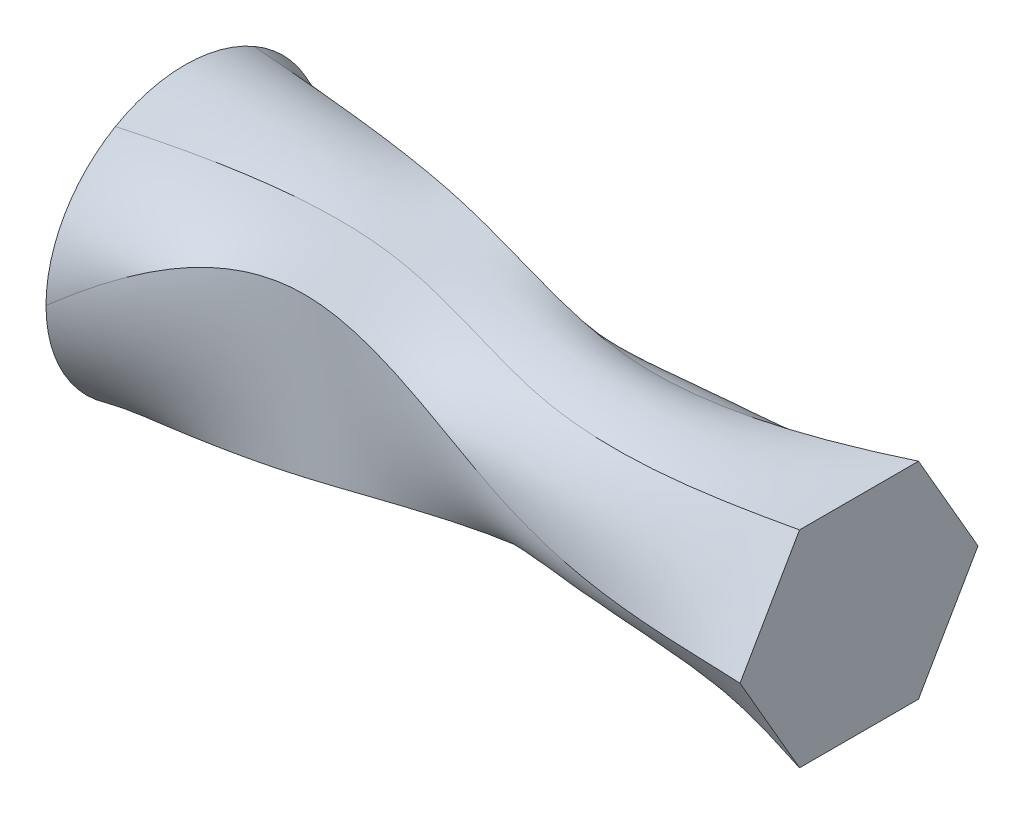
ISO-10303-21;
HEADER;
FILE_DESCRIPTION(('STEP AP214'),'2;1');
FILE_NAME('part.step','',(''),(''),'','','');
FILE_SCHEMA(('AUTOMOTIVE_DESIGN { 1 0 10303 214 1 1 1 1 }'));
ENDSEC;
DATA;
#1=APPLICATION_CONTEXT('core data for automotive mechanical design processes');
#2=APPLICATION_PROTOCOL_DEFINITION('international standard','automotive_design',2000,#1);
#3=PRODUCT_CONTEXT('',#1,'mechanical');
#4=PRODUCT('Part','Part','',(#3));
#5=PRODUCT_RELATED_PRODUCT_CATEGORY('part','',(#4));
#6=PRODUCT_DEFINITION_FORMATION('','',#4);
#7=PRODUCT_DEFINITION_CONTEXT('part definition',#1,'design');
#8=PRODUCT_DEFINITION('design','',#6,#7);
#9=PRODUCT_DEFINITION_SHAPE('','',#8);
#10=(LENGTH_UNIT() NAMED_UNIT(*) SI_UNIT(.MILLI.,.METRE.));
#11=(NAMED_UNIT(*) PLANE_ANGLE_UNIT() SI_UNIT($,.RADIAN.));
#12=(NAMED_UNIT(*) SI_UNIT($,.STERADIAN.) SOLID_ANGLE_UNIT());
#13=UNCERTAINTY_MEASURE_WITH_UNIT(LENGTH_MEASURE(1.E-05),#10,'distance_accuracy_value','');
#14=(GEOMETRIC_REPRESENTATION_CONTEXT(3) GLOBAL_UNCERTAINTY_ASSIGNED_CONTEXT((#13)) GLOBAL_UNIT_ASSIGNED_CONTEXT((#10,
#11,#12)) REPRESENTATION_CONTEXT('',''));
#15=CARTESIAN_POINT('',(0.,0.,0.));
#16=DIRECTION('',(0.,0.,1.));
#17=DIRECTION('',(1.,0.,0.));
#18=AXIS2_PLACEMENT_3D('',#15,#16,#17);
#19=CARTESIAN_POINT('',(431.8,0.,0.));
#20=DIRECTION('',(1.,0.,0.));
#21=DIRECTION('',(0.,0.,-1.));
#22=AXIS2_PLACEMENT_3D('',#19,#20,#21);
#23=PLANE('',#22);
#24=DIRECTION('',(0.,0.866025403784439,-0.5));
#25=VECTOR('',#24,1.);
#26=CARTESIAN_POINT('',(431.8,-65.9911357683743,-38.1));
#27=LINE('',#26,#25);
#28=CARTESIAN_POINT('',(431.8,-65.9911357683743,-38.1));
#29=VERTEX_POINT('',#28);
#30=CARTESIAN_POINT('',(431.8,0.,-76.2));
#31=VERTEX_POINT('',#30);
#32=EDGE_CURVE('E161',#29,#31,#27,.T.);
#33=ORIENTED_EDGE('',*,*,#32,.T.);
#34=DIRECTION('',(0.,0.866025403784439,0.5));
#35=VECTOR('',#34,1.);
#36=CARTESIAN_POINT('',(431.8,0.,-76.2));
#37=LINE('',#36,#35);
#38=CARTESIAN_POINT('',(431.8,65.9911357683743,-38.1));
#39=VERTEX_POINT('',#38);
#40=EDGE_CURVE('E242',#31,#39,#37,.T.);
#41=ORIENTED_EDGE('',*,*,#40,.T.);
#42=DIRECTION('',(0.,0.,1.));
#43=VECTOR('',#42,1.);
#44=CARTESIAN_POINT('',(431.8,65.9911357683743,-38.1));
#45=LINE('',#44,#43);
#46=CARTESIAN_POINT('',(431.8,65.9911357683743,38.1));
#47=VERTEX_POINT('',#46);
#48=EDGE_CURVE('E362',#39,#47,#45,.T.);
#49=ORIENTED_EDGE('',*,*,#48,.T.);
#50=DIRECTION('',(0.,-0.866025403784439,0.5));
#51=VECTOR('',#50,1.);
#52=CARTESIAN_POINT('',(431.8,65.9911357683743,38.1));
#53=LINE('',#52,#51);
#54=CARTESIAN_POINT('',(431.8,0.,76.2));
#55=VERTEX_POINT('',#54);
#56=EDGE_CURVE('E331',#47,#55,#53,.T.);
#57=ORIENTED_EDGE('',*,*,#56,.T.);
#58=DIRECTION('',(0.,-0.866025403784439,-0.5));
#59=VECTOR('',#58,1.);
#60=CARTESIAN_POINT('',(431.8,0.,76.2));
#61=LINE('',#60,#59);
#62=CARTESIAN_POINT('',(431.8,-65.9911357683743,38.1));
#63=VERTEX_POINT('',#62);
#64=EDGE_CURVE('E87',#55,#63,#61,.T.);
#65=ORIENTED_EDGE('',*,*,#64,.T.);
#66=DIRECTION('',(0.,0.,-1.));
#67=VECTOR('',#66,1.);
#68=CARTESIAN_POINT('',(431.8,-65.9911357683743,38.1));
#69=LINE('',#68,#67);
#70=EDGE_CURVE('E12',#63,#29,#69,.T.);
#71=ORIENTED_EDGE('',*,*,#70,.T.);
#72=EDGE_LOOP('',(#33,#41,#49,#57,#65,#71));
#73=FACE_BOUND('',#72,.T.);
#74=ADVANCED_FACE('F77',(#73),#23,.T.);
#75=CARTESIAN_POINT('',(0.,0.,0.));
#76=DIRECTION('',(1.,0.,0.));
#77=DIRECTION('',(0.,0.,-1.));
#78=AXIS2_PLACEMENT_3D('',#75,#76,#77);
#79=PLANE('',#78);
#80=CARTESIAN_POINT('',(0.,0.,0.));
#81=DIRECTION('',(1.,0.,0.));
#82=DIRECTION('',(0.,0.,-1.));
#83=AXIS2_PLACEMENT_3D('',#80,#81,#82);
#84=CIRCLE('',#83,88.9);
#85=CARTESIAN_POINT('',(0.,-76.9896583964366,-44.45));
#86=VERTEX_POINT('',#85);
#87=CARTESIAN_POINT('',(0.,0.,-88.9));
#88=VERTEX_POINT('',#87);
#89=EDGE_CURVE('E134',#86,#88,#84,.T.);
#90=ORIENTED_EDGE('',*,*,#89,.F.);
#91=CARTESIAN_POINT('',(0.,-76.9896583964366,44.45));
#92=VERTEX_POINT('',#91);
#93=EDGE_CURVE('E139',#92,#86,#84,.T.);
#94=ORIENTED_EDGE('',*,*,#93,.F.);
#95=CARTESIAN_POINT('',(0.,0.,88.9));
#96=VERTEX_POINT('',#95);
#97=EDGE_CURVE('E157',#96,#92,#84,.T.);
#98=ORIENTED_EDGE('',*,*,#97,.F.);
#99=CARTESIAN_POINT('',(0.,76.9896583964366,44.45));
#100=VERTEX_POINT('',#99);
#101=EDGE_CURVE('E359',#100,#96,#84,.T.);
#102=ORIENTED_EDGE('',*,*,#101,.F.);
#103=CARTESIAN_POINT('',(0.,76.9896583964366,-44.45));
#104=VERTEX_POINT('',#103);
#105=EDGE_CURVE('E284',#104,#100,#84,.T.);
#106=ORIENTED_EDGE('',*,*,#105,.F.);
#107=EDGE_CURVE('E142',#88,#104,#84,.T.);
#108=ORIENTED_EDGE('',*,*,#107,.F.);
#109=EDGE_LOOP('',(#90,#94,#98,#102,#106,#108));
#110=FACE_BOUND('',#109,.T.);
#111=ADVANCED_FACE('F137',(#110),#79,.F.);
#112=CARTESIAN_POINT('',(0.,76.9896583964366,-44.45));
#113=CARTESIAN_POINT('',(42.3110394708517,65.0320435038654,-51.8600053730186));
#114=CARTESIAN_POINT('',(124.00772003458,48.1179722895203,-60.6327219805271));
#115=CARTESIAN_POINT('',(269.154833405398,39.2616708567669,-11.0349091645005));
#116=CARTESIAN_POINT('',(372.472531394671,54.2772405364929,-27.166422303));
#117=CARTESIAN_POINT('',(431.8,65.9911357683743,-38.1));
#118=CARTESIAN_POINT('',(0.,92.8677953830071,-16.9482600097212));
#119=CARTESIAN_POINT('',(41.8970215409414,80.9639629971746,-30.6760993448724));
#120=CARTESIAN_POINT('',(124.187510613034,36.658213683305,-44.5992282699514));
#121=CARTESIAN_POINT('',(269.095832286801,59.1427539630736,2.83558147627812));
#122=CARTESIAN_POINT('',(372.434307549649,54.2753354721251,-5.77103737451658));
#123=CARTESIAN_POINT('',(431.8,65.9911357683743,-12.7));
#124=CARTESIAN_POINT('',(0.,92.8677953830071,16.9482600097212));
#125=CARTESIAN_POINT('',(41.483003611031,81.0177455039133,-3.09741328756266));
#126=CARTESIAN_POINT('',(124.367301191488,36.6342613431675,-33.1714049594706));
#127=CARTESIAN_POINT('',(269.036831168204,59.1527330375151,24.7089845070858));
#128=CARTESIAN_POINT('',(372.396083704627,54.2734304077572,15.6243475539669));
#129=CARTESIAN_POINT('',(431.8,65.9911357683743,12.7));
#130=CARTESIAN_POINT('',(0.,76.9896583964366,44.45));
#131=CARTESIAN_POINT('',(41.0689856811206,65.1933910240814,18.0864927405835));
#132=CARTESIAN_POINT('',(124.547091769942,48.0461152691076,-17.1379112488949));
#133=CARTESIAN_POINT('',(268.977830049607,39.2916080800914,38.5794751478644));
#134=CARTESIAN_POINT('',(372.357859859604,54.2715253433893,37.0197324824503));
#135=CARTESIAN_POINT('',(431.8,65.9911357683743,38.1));
#136=B_SPLINE_SURFACE_WITH_KNOTS('',3,3,((#112,#113,#114,#115,#116,#117),(#118,#119,#120,#121,
#122,#123),(#124,#125,#126,#127,#128,#129),(#130,#131,#132,#133,#134,#135)),.UNSPECIFIED.,.F.,
.F.,.F.,(4,4),(4,1,1,4),(0.,1.),(0.,0.305461386834387,0.598982931163159,1.),.UNSPECIFIED.);
#137=CARTESIAN_POINT('',(0.,76.9896583964366,44.45));
#138=CARTESIAN_POINT('',(41.0689856811206,65.1933910240814,18.0864927405835));
#139=CARTESIAN_POINT('',(124.547091769942,48.0461152691076,-17.1379112488949));
#140=CARTESIAN_POINT('',(268.977830049607,39.2916080800914,38.5794751478644));
#141=CARTESIAN_POINT('',(372.357859859604,54.2715253433893,37.0197324824503));
#142=CARTESIAN_POINT('',(431.8,65.9911357683743,38.1));
#143=B_SPLINE_CURVE_WITH_KNOTS('',3,(#137,#138,#139,#140,#141,#142),.UNSPECIFIED.,.F.,.F.,(4,1,
1,4),(0.,0.305461386834387,0.598982931163159,1.),.UNSPECIFIED.);
#144=EDGE_CURVE('E313',#100,#47,#143,.T.);
#145=CARTESIAN_POINT('',(0.,76.9896583964366,-44.45));
#146=CARTESIAN_POINT('',(42.3110394708517,65.0320435038654,-51.8600053730186));
#147=CARTESIAN_POINT('',(124.00772003458,48.1179722895203,-60.6327219805271));
#148=CARTESIAN_POINT('',(269.154833405398,39.2616708567669,-11.0349091645005));
#149=CARTESIAN_POINT('',(372.472531394671,54.2772405364929,-27.166422303));
#150=CARTESIAN_POINT('',(431.8,65.9911357683743,-38.1));
#151=B_SPLINE_CURVE_WITH_KNOTS('',3,(#145,#146,#147,#148,#149,#150),.UNSPECIFIED.,.F.,.F.,(4,1,
1,4),(0.,0.305461386834387,0.598982931163159,1.),.UNSPECIFIED.);
#152=EDGE_CURVE('E148',#39,#104,#151,.F.);
#153=ORIENTED_EDGE('',*,*,#105,.T.);
#154=ORIENTED_EDGE('',*,*,#144,.T.);
#155=ORIENTED_EDGE('',*,*,#48,.F.);
#156=ORIENTED_EDGE('',*,*,#152,.T.);
#157=EDGE_LOOP('',(#153,#154,#155,#156));
#158=FACE_BOUND('',#157,.T.);
#159=ADVANCED_FACE('F290',(#158),#136,.T.);
#160=CARTESIAN_POINT('',(0.,76.9896583964366,44.45));
#161=CARTESIAN_POINT('',(41.0689856811206,65.1933910240814,18.0864927405835));
#162=CARTESIAN_POINT('',(124.547091769942,48.0461152691076,-17.1379112488949));
#163=CARTESIAN_POINT('',(268.977830049607,39.2916080800914,38.5794751478644));
#164=CARTESIAN_POINT('',(372.357859859604,54.2715253433893,37.0197324824503));
#165=CARTESIAN_POINT('',(431.8,65.9911357683743,38.1));
#166=CARTESIAN_POINT('',(0.,61.1115214098661,71.9517399902788));
#167=CARTESIAN_POINT('',(41.1799214510921,64.5362320505182,48.0726455011163));
#168=CARTESIAN_POINT('',(124.465262837438,50.8987080256825,-6.07205660365536));
#169=CARTESIAN_POINT('',(269.124149492804,29.242354930749,58.1453940341137));
#170=CARTESIAN_POINT('',(371.9807059765,32.961031809836,46.0453697534008));
#171=CARTESIAN_POINT('',(431.8,43.9940905122495,50.8));
#172=CARTESIAN_POINT('',(0.,31.7562739731411,88.9));
#173=CARTESIAN_POINT('',(41.2908572210635,50.4019626268005,67.5053182810916));
#174=CARTESIAN_POINT('',(124.383433904934,63.4578314832364,12.5946615807174));
#175=CARTESIAN_POINT('',(269.270468936001,2.32682433144747,64.5038882225388));
#176=CARTESIAN_POINT('',(371.603552093395,11.6505382762827,55.0710070243513));
#177=CARTESIAN_POINT('',(431.8,21.9970452561248,63.5));
#178=CARTESIAN_POINT('',(0.,0.,88.9));
#179=CARTESIAN_POINT('',(41.401792991035,33.8666666666667,69.9897310513456));
#180=CARTESIAN_POINT('',(124.30160497243,77.746230505889,43.4679137043182));
#181=CARTESIAN_POINT('',(269.416788379198,-27.5935328497602,49.6520453231108));
#182=CARTESIAN_POINT('',(371.226398210291,-9.65995525727066,64.0966442953018));
#183=CARTESIAN_POINT('',(431.8,0.,76.2));
#184=B_SPLINE_SURFACE_WITH_KNOTS('',3,3,((#160,#161,#162,#163,#164,#165),(#166,#167,#168,#169,
#170,#171),(#172,#173,#174,#175,#176,#177),(#178,#179,#180,#181,#182,#183)),.UNSPECIFIED.,.F.,
.F.,.F.,(4,4),(4,1,1,4),(0.,1.),(0.,0.305461386834387,0.598982931163159,1.),.UNSPECIFIED.);
#185=CARTESIAN_POINT('',(0.,0.,88.9));
#186=CARTESIAN_POINT('',(41.401792991035,33.8666666666667,69.9897310513456));
#187=CARTESIAN_POINT('',(124.30160497243,77.746230505889,43.4679137043182));
#188=CARTESIAN_POINT('',(269.416788379198,-27.5935328497602,49.6520453231108));
#189=CARTESIAN_POINT('',(371.226398210291,-9.65995525727066,64.0966442953018));
#190=CARTESIAN_POINT('',(431.8,0.,76.2));
#191=B_SPLINE_CURVE_WITH_KNOTS('',3,(#185,#186,#187,#188,#189,#190),.UNSPECIFIED.,.F.,.F.,(4,1,
1,4),(0.,0.305461386834387,0.598982931163159,1.),.UNSPECIFIED.);
#192=EDGE_CURVE('E166',#96,#55,#191,.T.);
#193=ORIENTED_EDGE('',*,*,#101,.T.);
#194=ORIENTED_EDGE('',*,*,#192,.T.);
#195=ORIENTED_EDGE('',*,*,#56,.F.);
#196=ORIENTED_EDGE('',*,*,#144,.F.);
#197=EDGE_LOOP('',(#193,#194,#195,#196));
#198=FACE_BOUND('',#197,.T.);
#199=ADVANCED_FACE('F258',(#198),#184,.T.);
#200=CARTESIAN_POINT('',(0.,0.,-88.9));
#201=CARTESIAN_POINT('',(41.4017929910351,-33.8666666666667,-69.9897310513439));
#202=CARTESIAN_POINT('',(124.301604972432,-77.746230505889,-43.4679137043141));
#203=CARTESIAN_POINT('',(269.416788379197,27.5935328497602,-49.6520453231122));
#204=CARTESIAN_POINT('',(371.226398210291,9.65995525727069,-64.0966442953023));
#205=CARTESIAN_POINT('',(431.8,0.,-76.2));
#206=CARTESIAN_POINT('',(0.,31.7562739731411,-88.9));
#207=CARTESIAN_POINT('',(41.704875150974,5.19262456450627,-78.7631558252354));
#208=CARTESIAN_POINT('',(124.203643326481,-40.1798568511448,-38.518205990522));
#209=CARTESIAN_POINT('',(269.329470054598,39.1082223900196,-55.3223662280852));
#210=CARTESIAN_POINT('',(371.641775938418,24.5323836836781,-51.7865702978682));
#211=CARTESIAN_POINT('',(431.8,21.9970452561247,-63.5));
#212=CARTESIAN_POINT('',(0.,61.1115214098661,-71.9517399902788));
#213=CARTESIAN_POINT('',(42.0079573109129,41.850889259263,-70.5883205894058));
#214=CARTESIAN_POINT('',(124.10568168053,-0.884207631301739,-45.7750322159579));
#215=CARTESIAN_POINT('',(269.242151729998,47.6180853483728,-39.7823500452049));
#216=CARTESIAN_POINT('',(372.057153666545,39.4048121100855,-39.4764963004341));
#217=CARTESIAN_POINT('',(431.8,43.9940905122495,-50.8));
#218=CARTESIAN_POINT('',(0.,76.9896583964366,-44.45));
#219=CARTESIAN_POINT('',(42.3110394708517,65.0320435038654,-51.8600053730186));
#220=CARTESIAN_POINT('',(124.00772003458,48.1179722895203,-60.6327219805271));
#221=CARTESIAN_POINT('',(269.154833405398,39.2616708567669,-11.0349091645005));
#222=CARTESIAN_POINT('',(372.472531394671,54.2772405364929,-27.166422303));
#223=CARTESIAN_POINT('',(431.8,65.9911357683743,-38.1));
#224=B_SPLINE_SURFACE_WITH_KNOTS('',3,3,((#200,#201,#202,#203,#204,#205),(#206,#207,#208,#209,
#210,#211),(#212,#213,#214,#215,#216,#217),(#218,#219,#220,#221,#222,#223)),.UNSPECIFIED.,.F.,
.F.,.F.,(4,4),(4,1,1,4),(0.,1.),(0.,0.305461386834387,0.598982931163159,1.),.UNSPECIFIED.);
#225=CARTESIAN_POINT('',(0.,0.,-88.9));
#226=CARTESIAN_POINT('',(41.4017929910351,-33.8666666666667,-69.9897310513439));
#227=CARTESIAN_POINT('',(124.301604972432,-77.746230505889,-43.4679137043141));
#228=CARTESIAN_POINT('',(269.416788379197,27.5935328497602,-49.6520453231122));
#229=CARTESIAN_POINT('',(371.226398210291,9.65995525727068,-64.0966442953023));
#230=CARTESIAN_POINT('',(431.8,0.,-76.2));
#231=B_SPLINE_CURVE_WITH_KNOTS('',3,(#225,#226,#227,#228,#229,#230),.UNSPECIFIED.,.F.,.F.,(4,1,
1,4),(0.,0.305461386834387,0.598982931163159,1.),.UNSPECIFIED.);
#232=EDGE_CURVE('E163',#88,#31,#231,.T.);
#233=ORIENTED_EDGE('',*,*,#107,.T.);
#234=ORIENTED_EDGE('',*,*,#152,.F.);
#235=ORIENTED_EDGE('',*,*,#40,.F.);
#236=ORIENTED_EDGE('',*,*,#232,.F.);
#237=EDGE_LOOP('',(#233,#234,#235,#236));
#238=FACE_BOUND('',#237,.T.);
#239=ADVANCED_FACE('F247',(#238),#224,.T.);
#240=CARTESIAN_POINT('',(0.,0.,88.9));
#241=CARTESIAN_POINT('',(41.401792991035,33.8666666666667,69.9897310513456));
#242=CARTESIAN_POINT('',(124.30160497243,77.746230505889,43.4679137043182));
#243=CARTESIAN_POINT('',(269.416788379198,-27.5935328497602,49.6520453231108));
#244=CARTESIAN_POINT('',(371.226398210291,-9.65995525727067,64.0966442953018));
#245=CARTESIAN_POINT('',(431.8,0.,76.2));
#246=CARTESIAN_POINT('',(0.,-31.7562739731411,88.9));
#247=CARTESIAN_POINT('',(41.7048751509738,-5.19262456450625,78.7631558252372));
#248=CARTESIAN_POINT('',(124.20364332648,40.1798568511447,38.5182059905261));
#249=CARTESIAN_POINT('',(269.329470054598,-39.1082223900196,55.3223662280837));
#250=CARTESIAN_POINT('',(371.641775938418,-24.5323836836781,51.7865702978677));
#251=CARTESIAN_POINT('',(431.8,-21.9970452561247,63.5));
#252=CARTESIAN_POINT('',(0.,-61.1115214098661,71.9517399902788));
#253=CARTESIAN_POINT('',(42.0079573109127,-41.850889259263,70.5883205894075));
#254=CARTESIAN_POINT('',(124.105681680529,0.884207631301724,45.775032215962));
#255=CARTESIAN_POINT('',(269.242151729999,-47.6180853483728,39.7823500452035));
#256=CARTESIAN_POINT('',(372.057153666544,-39.4048121100855,39.4764963004336));
#257=CARTESIAN_POINT('',(431.8,-43.9940905122495,50.8));
#258=CARTESIAN_POINT('',(0.,-76.9896583964366,44.45));
#259=CARTESIAN_POINT('',(42.3110394708516,-65.0320435038653,51.8600053730203));
#260=CARTESIAN_POINT('',(124.007720034579,-48.1179722895203,60.6327219805312));
#261=CARTESIAN_POINT('',(269.154833405399,-39.2616708567669,11.034909164499));
#262=CARTESIAN_POINT('',(372.472531394671,-54.2772405364929,27.1664223029995));
#263=CARTESIAN_POINT('',(431.8,-65.9911357683743,38.1));
#264=B_SPLINE_SURFACE_WITH_KNOTS('',3,3,((#240,#241,#242,#243,#244,#245),(#246,#247,#248,#249,
#250,#251),(#252,#253,#254,#255,#256,#257),(#258,#259,#260,#261,#262,#263)),.UNSPECIFIED.,.F.,
.F.,.F.,(4,4),(4,1,1,4),(0.,1.),(0.,0.305461386834387,0.598982931163159,1.),.UNSPECIFIED.);
#265=CARTESIAN_POINT('',(0.,-76.9896583964366,44.45));
#266=CARTESIAN_POINT('',(42.3110394708516,-65.0320435038653,51.8600053730203));
#267=CARTESIAN_POINT('',(124.007720034579,-48.1179722895203,60.6327219805312));
#268=CARTESIAN_POINT('',(269.154833405399,-39.2616708567669,11.034909164499));
#269=CARTESIAN_POINT('',(372.472531394671,-54.2772405364929,27.1664223029995));
#270=CARTESIAN_POINT('',(431.8,-65.9911357683743,38.1));
#271=B_SPLINE_CURVE_WITH_KNOTS('',3,(#265,#266,#267,#268,#269,#270),.UNSPECIFIED.,.F.,.F.,(4,1,
1,4),(0.,0.305461386834387,0.598982931163159,1.),.UNSPECIFIED.);
#272=EDGE_CURVE('E102',#92,#63,#271,.T.);
#273=ORIENTED_EDGE('',*,*,#97,.T.);
#274=ORIENTED_EDGE('',*,*,#272,.T.);
#275=ORIENTED_EDGE('',*,*,#64,.F.);
#276=ORIENTED_EDGE('',*,*,#192,.F.);
#277=EDGE_LOOP('',(#273,#274,#275,#276));
#278=FACE_BOUND('',#277,.T.);
#279=ADVANCED_FACE('F201',(#278),#264,.T.);
#280=CARTESIAN_POINT('',(0.,-76.9896583964366,44.45));
#281=CARTESIAN_POINT('',(42.3110394708516,-65.0320435038653,51.8600053730203));
#282=CARTESIAN_POINT('',(124.007720034579,-48.1179722895203,60.6327219805312));
#283=CARTESIAN_POINT('',(269.154833405399,-39.2616708567669,11.034909164499));
#284=CARTESIAN_POINT('',(372.472531394671,-54.2772405364929,27.1664223029995));
#285=CARTESIAN_POINT('',(431.8,-65.9911357683743,38.1));
#286=CARTESIAN_POINT('',(0.,-92.8677953830071,16.9482600097212));
#287=CARTESIAN_POINT('',(41.8970215409412,-80.9639629971746,30.6760993448742));
#288=CARTESIAN_POINT('',(124.187510613033,-36.658213683305,44.5992282699556));
#289=CARTESIAN_POINT('',(269.095832286802,-59.1427539630736,-2.83558147627959));
#290=CARTESIAN_POINT('',(372.434307549649,-54.2753354721251,5.77103737451609));
#291=CARTESIAN_POINT('',(431.8,-65.9911357683743,12.7));
#292=CARTESIAN_POINT('',(0.,-92.8677953830071,-16.9482600097212));
#293=CARTESIAN_POINT('',(41.4830036110309,-81.0177455039133,3.09741328756441));
#294=CARTESIAN_POINT('',(124.367301191487,-36.6342613431675,33.1714049594747));
#295=CARTESIAN_POINT('',(269.036831168205,-59.1527330375151,-24.7089845070873));
#296=CARTESIAN_POINT('',(372.396083704627,-54.2734304077572,-15.6243475539674));
#297=CARTESIAN_POINT('',(431.8,-65.9911357683743,-12.7));
#298=CARTESIAN_POINT('',(0.,-76.9896583964366,-44.45));
#299=CARTESIAN_POINT('',(41.0689856811206,-65.1933910240814,-18.0864927405817));
#300=CARTESIAN_POINT('',(124.547091769942,-48.0461152691076,17.137911248899));
#301=CARTESIAN_POINT('',(268.977830049607,-39.2916080800914,-38.5794751478659));
#302=CARTESIAN_POINT('',(372.357859859604,-54.2715253433893,-37.0197324824508));
#303=CARTESIAN_POINT('',(431.8,-65.9911357683743,-38.1));
#304=B_SPLINE_SURFACE_WITH_KNOTS('',3,3,((#280,#281,#282,#283,#284,#285),(#286,#287,#288,#289,
#290,#291),(#292,#293,#294,#295,#296,#297),(#298,#299,#300,#301,#302,#303)),.UNSPECIFIED.,.F.,
.F.,.F.,(4,4),(4,1,1,4),(0.,1.),(0.,0.305461386834387,0.598982931163159,1.),.UNSPECIFIED.);
#305=CARTESIAN_POINT('',(0.,-76.9896583964366,-44.45));
#306=CARTESIAN_POINT('',(41.0689856811206,-65.1933910240814,-18.0864927405817));
#307=CARTESIAN_POINT('',(124.547091769942,-48.0461152691076,17.137911248899));
#308=CARTESIAN_POINT('',(268.977830049607,-39.2916080800914,-38.5794751478659));
#309=CARTESIAN_POINT('',(372.357859859604,-54.2715253433893,-37.0197324824508));
#310=CARTESIAN_POINT('',(431.8,-65.9911357683743,-38.1));
#311=B_SPLINE_CURVE_WITH_KNOTS('',3,(#305,#306,#307,#308,#309,#310),.UNSPECIFIED.,.F.,.F.,(4,1,
1,4),(0.,0.305461386834387,0.598982931163159,1.),.UNSPECIFIED.);
#312=EDGE_CURVE('E156',#86,#29,#311,.T.);
#313=ORIENTED_EDGE('',*,*,#93,.T.);
#314=ORIENTED_EDGE('',*,*,#312,.T.);
#315=ORIENTED_EDGE('',*,*,#70,.F.);
#316=ORIENTED_EDGE('',*,*,#272,.F.);
#317=EDGE_LOOP('',(#313,#314,#315,#316));
#318=FACE_BOUND('',#317,.T.);
#319=ADVANCED_FACE('F155',(#318),#304,.T.);
#320=CARTESIAN_POINT('',(0.,-76.9896583964366,-44.45));
#321=CARTESIAN_POINT('',(41.0689856811206,-65.1933910240814,-18.0864927405817));
#322=CARTESIAN_POINT('',(124.547091769942,-48.0461152691076,17.137911248899));
#323=CARTESIAN_POINT('',(268.977830049607,-39.2916080800914,-38.5794751478659));
#324=CARTESIAN_POINT('',(372.357859859604,-54.2715253433893,-37.0197324824508));
#325=CARTESIAN_POINT('',(431.8,-65.9911357683743,-38.1));
#326=CARTESIAN_POINT('',(0.,-61.111521409866,-71.9517399902788));
#327=CARTESIAN_POINT('',(41.1799214510921,-64.5362320505181,-48.0726455011146));
#328=CARTESIAN_POINT('',(124.465262837438,-50.8987080256825,6.07205660365944));
#329=CARTESIAN_POINT('',(269.124149492804,-29.2423549307489,-58.1453940341152));
#330=CARTESIAN_POINT('',(371.9807059765,-32.961031809836,-46.0453697534013));
#331=CARTESIAN_POINT('',(431.8,-43.9940905122495,-50.8));
#332=CARTESIAN_POINT('',(0.,-31.7562739731411,-88.9));
#333=CARTESIAN_POINT('',(41.2908572210636,-50.4019626268005,-67.5053182810898));
#334=CARTESIAN_POINT('',(124.383433904935,-63.4578314832364,-12.5946615807133));
#335=CARTESIAN_POINT('',(269.270468936001,-2.32682433144748,-64.5038882225403));
#336=CARTESIAN_POINT('',(371.603552093395,-11.6505382762827,-55.0710070243518));
#337=CARTESIAN_POINT('',(431.8,-21.9970452561248,-63.5));
#338=CARTESIAN_POINT('',(0.,0.,-88.9));
#339=CARTESIAN_POINT('',(41.4017929910351,-33.8666666666667,-69.9897310513439));
#340=CARTESIAN_POINT('',(124.301604972432,-77.746230505889,-43.4679137043141));
#341=CARTESIAN_POINT('',(269.416788379197,27.5935328497602,-49.6520453231122));
#342=CARTESIAN_POINT('',(371.226398210291,9.65995525727068,-64.0966442953023));
#343=CARTESIAN_POINT('',(431.8,0.,-76.2));
#344=B_SPLINE_SURFACE_WITH_KNOTS('',3,3,((#320,#321,#322,#323,#324,#325),(#326,#327,#328,#329,
#330,#331),(#332,#333,#334,#335,#336,#337),(#338,#339,#340,#341,#342,#343)),.UNSPECIFIED.,.F.,
.F.,.F.,(4,4),(4,1,1,4),(0.,1.),(0.,0.305461386834387,0.598982931163159,1.),.UNSPECIFIED.);
#345=ORIENTED_EDGE('',*,*,#89,.T.);
#346=ORIENTED_EDGE('',*,*,#232,.T.);
#347=ORIENTED_EDGE('',*,*,#32,.F.);
#348=ORIENTED_EDGE('',*,*,#312,.F.);
#349=EDGE_LOOP('',(#345,#346,#347,#348));
#350=FACE_BOUND('',#349,.T.);
#351=ADVANCED_FACE('F160',(#350),#344,.T.);
#352=CLOSED_SHELL('',(#74,#111,#159,#199,#239,#279,#319,#351));
#353=MANIFOLD_SOLID_BREP('B2',#352);
#354=ADVANCED_BREP_SHAPE_REPRESENTATION('',(#18,#353),#14);
#355=SHAPE_DEFINITION_REPRESENTATION(#9,#354);
ENDSEC;
END-ISO-10303-21;
